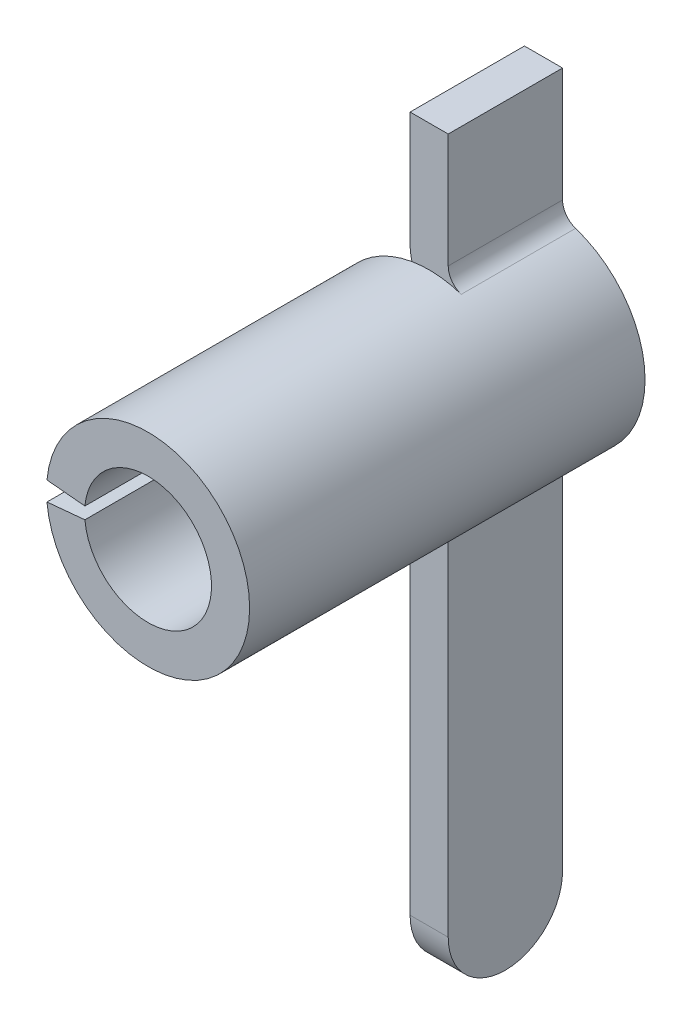
ISO-10303-21;
HEADER;
FILE_DESCRIPTION(('STEP AP214'),'2;1');
FILE_NAME('part.step','',(''),(''),'','','');
FILE_SCHEMA(('AUTOMOTIVE_DESIGN { 1 0 10303 214 1 1 1 1 }'));
ENDSEC;
DATA;
#1=APPLICATION_CONTEXT('core data for automotive mechanical design processes');
#2=APPLICATION_PROTOCOL_DEFINITION('international standard','automotive_design',2000,#1);
#3=PRODUCT_CONTEXT('',#1,'mechanical');
#4=PRODUCT('Part','Part','',(#3));
#5=PRODUCT_RELATED_PRODUCT_CATEGORY('part','',(#4));
#6=PRODUCT_DEFINITION_FORMATION('','',#4);
#7=PRODUCT_DEFINITION_CONTEXT('part definition',#1,'design');
#8=PRODUCT_DEFINITION('design','',#6,#7);
#9=PRODUCT_DEFINITION_SHAPE('','',#8);
#10=(LENGTH_UNIT() NAMED_UNIT(*) SI_UNIT(.MILLI.,.METRE.));
#11=(NAMED_UNIT(*) PLANE_ANGLE_UNIT() SI_UNIT($,.RADIAN.));
#12=(NAMED_UNIT(*) SI_UNIT($,.STERADIAN.) SOLID_ANGLE_UNIT());
#13=UNCERTAINTY_MEASURE_WITH_UNIT(LENGTH_MEASURE(1.E-05),#10,'distance_accuracy_value','');
#14=(GEOMETRIC_REPRESENTATION_CONTEXT(3) GLOBAL_UNCERTAINTY_ASSIGNED_CONTEXT((#13)) GLOBAL_UNIT_ASSIGNED_CONTEXT((#10,
#11,#12)) REPRESENTATION_CONTEXT('',''));
#15=CARTESIAN_POINT('',(0.,0.,0.));
#16=DIRECTION('',(0.,0.,1.));
#17=DIRECTION('',(1.,0.,0.));
#18=AXIS2_PLACEMENT_3D('',#15,#16,#17);
#19=CARTESIAN_POINT('',(0.306963486373836,-1.54645639494626,-11.3));
#20=DIRECTION('',(0.,0.,1.));
#21=DIRECTION('',(1.,0.,0.));
#22=AXIS2_PLACEMENT_3D('',#19,#20,#21);
#23=PLANE('',#22);
#24=DIRECTION('',(0.,1.,0.));
#25=VECTOR('',#24,1.);
#26=CARTESIAN_POINT('',(0.700000000000003,0.,-11.3));
#27=LINE('',#26,#25);
#28=CARTESIAN_POINT('',(0.700000000000005,1.79895878505357,-11.3));
#29=VERTEX_POINT('',#28);
#30=CARTESIAN_POINT('',(0.700000000000002,-1.9,-11.3));
#31=VERTEX_POINT('',#30);
#32=EDGE_CURVE('E156',#29,#31,#27,.F.);
#33=ORIENTED_EDGE('',*,*,#32,.F.);
#34=CARTESIAN_POINT('',(0.900000000000003,1.79895878505357,-11.3));
#35=DIRECTION('',(0.,0.,1.));
#36=DIRECTION('',(1.,0.,0.));
#37=AXIS2_PLACEMENT_3D('',#34,#35,#36);
#38=CIRCLE('',#37,0.2);
#39=CARTESIAN_POINT('',(0.836803799557334,1.98871188845272,-11.3));
#40=VERTEX_POINT('',#39);
#41=EDGE_CURVE('E141',#29,#40,#38,.F.);
#42=ORIENTED_EDGE('',*,*,#41,.T.);
#43=CARTESIAN_POINT('',(0.500000000000003,3.,-11.3));
#44=DIRECTION('',(0.,0.,1.));
#45=DIRECTION('',(1.,0.,0.));
#46=AXIS2_PLACEMENT_3D('',#43,#44,#45);
#47=CIRCLE('',#46,1.06589889011722);
#48=CARTESIAN_POINT('',(0.319204456495264,1.94954609077697,-11.3));
#49=VERTEX_POINT('',#48);
#50=EDGE_CURVE('E19',#40,#49,#47,.F.);
#51=ORIENTED_EDGE('',*,*,#50,.T.);
#52=CARTESIAN_POINT('',(0.900000000000003,1.79895878505357,-11.3));
#53=DIRECTION('',(0.,0.,1.));
#54=DIRECTION('',(1.,0.,0.));
#55=AXIS2_PLACEMENT_3D('',#52,#53,#54);
#56=CIRCLE('',#55,0.6);
#57=CARTESIAN_POINT('',(0.300000000000003,1.79895878505357,-11.3));
#58=VERTEX_POINT('',#57);
#59=EDGE_CURVE('E132',#49,#58,#56,.T.);
#60=ORIENTED_EDGE('',*,*,#59,.T.);
#61=DIRECTION('',(0.,-1.,0.));
#62=VECTOR('',#61,1.);
#63=CARTESIAN_POINT('',(0.300000000000003,1.79895878505357,-11.3));
#64=LINE('',#63,#62);
#65=CARTESIAN_POINT('',(0.300000000000003,-1.9,-11.3));
#66=VERTEX_POINT('',#65);
#67=EDGE_CURVE('E167',#66,#58,#64,.F.);
#68=ORIENTED_EDGE('',*,*,#67,.F.);
#69=DIRECTION('',(-1.,0.,0.));
#70=VECTOR('',#69,1.);
#71=CARTESIAN_POINT('',(-4.5,-1.9,-11.3));
#72=LINE('',#71,#70);
#73=EDGE_CURVE('E161',#31,#66,#72,.T.);
#74=ORIENTED_EDGE('',*,*,#73,.F.);
#75=EDGE_LOOP('',(#33,#42,#51,#60,#68,#74));
#76=FACE_BOUND('',#75,.T.);
#77=ADVANCED_FACE('F16',(#76),#23,.T.);
#78=CARTESIAN_POINT('',(-4.5,-1.9,-11.9));
#79=DIRECTION('',(-1.,0.,0.));
#80=DIRECTION('',(0.,0.,1.));
#81=AXIS2_PLACEMENT_3D('',#78,#79,#80);
#82=CYLINDRICAL_SURFACE('',#81,0.6);
#83=ORIENTED_EDGE('',*,*,#73,.T.);
#84=CARTESIAN_POINT('',(0.300000000000003,-1.9,-11.9));
#85=DIRECTION('',(-1.,0.,0.));
#86=DIRECTION('',(0.,0.,1.));
#87=AXIS2_PLACEMENT_3D('',#84,#85,#86);
#88=CIRCLE('',#87,0.6);
#89=CARTESIAN_POINT('',(0.300000000000003,-1.9,-12.5));
#90=VERTEX_POINT('',#89);
#91=EDGE_CURVE('E168',#90,#66,#88,.T.);
#92=ORIENTED_EDGE('',*,*,#91,.F.);
#93=DIRECTION('',(-1.,0.,0.));
#94=VECTOR('',#93,1.);
#95=CARTESIAN_POINT('',(-4.5,-1.9,-12.5));
#96=LINE('',#95,#94);
#97=CARTESIAN_POINT('',(0.700000000000003,-1.9,-12.5));
#98=VERTEX_POINT('',#97);
#99=EDGE_CURVE('E159',#90,#98,#96,.F.);
#100=ORIENTED_EDGE('',*,*,#99,.T.);
#101=CARTESIAN_POINT('',(0.700000000000003,-1.9,-11.9));
#102=DIRECTION('',(-1.,0.,0.));
#103=DIRECTION('',(0.,0.,1.));
#104=AXIS2_PLACEMENT_3D('',#101,#102,#103);
#105=CIRCLE('',#104,0.6);
#106=EDGE_CURVE('E164',#31,#98,#105,.F.);
#107=ORIENTED_EDGE('',*,*,#106,.F.);
#108=EDGE_LOOP('',(#83,#92,#100,#107));
#109=FACE_BOUND('',#108,.T.);
#110=ADVANCED_FACE('F314',(#109),#82,.T.);
#111=CARTESIAN_POINT('',(0.700000000000003,0.,-11.3));
#112=DIRECTION('',(1.,0.,0.));
#113=DIRECTION('',(0.,1.,0.));
#114=AXIS2_PLACEMENT_3D('',#111,#112,#113);
#115=PLANE('',#114);
#116=ORIENTED_EDGE('',*,*,#32,.T.);
#117=ORIENTED_EDGE('',*,*,#106,.T.);
#118=DIRECTION('',(0.,1.,0.));
#119=VECTOR('',#118,1.);
#120=CARTESIAN_POINT('',(0.700000000000003,-1.54645639494626,-12.5));
#121=LINE('',#120,#119);
#122=CARTESIAN_POINT('',(0.700000000000004,1.79895878505357,-12.5));
#123=VERTEX_POINT('',#122);
#124=EDGE_CURVE('E171',#98,#123,#121,.T.);
#125=ORIENTED_EDGE('',*,*,#124,.T.);
#126=DIRECTION('',(0.,0.,1.));
#127=VECTOR('',#126,1.);
#128=CARTESIAN_POINT('',(0.700000000000005,1.79895878505357,-11.3));
#129=LINE('',#128,#127);
#130=EDGE_CURVE('E223',#123,#29,#129,.T.);
#131=ORIENTED_EDGE('',*,*,#130,.T.);
#132=EDGE_LOOP('',(#116,#117,#125,#131));
#133=FACE_BOUND('',#132,.T.);
#134=ADVANCED_FACE('F316',(#133),#115,.T.);
#135=CARTESIAN_POINT('',(0.300000000000003,1.79895878505357,-11.3));
#136=DIRECTION('',(-1.,0.,0.));
#137=DIRECTION('',(0.,-1.,0.));
#138=AXIS2_PLACEMENT_3D('',#135,#136,#137);
#139=PLANE('',#138);
#140=DIRECTION('',(0.,1.,0.));
#141=VECTOR('',#140,1.);
#142=CARTESIAN_POINT('',(0.300000000000003,-1.54645639494626,-12.5));
#143=LINE('',#142,#141);
#144=CARTESIAN_POINT('',(0.300000000000003,1.79895878505357,-12.5));
#145=VERTEX_POINT('',#144);
#146=EDGE_CURVE('E181',#145,#90,#143,.F.);
#147=ORIENTED_EDGE('',*,*,#146,.T.);
#148=ORIENTED_EDGE('',*,*,#91,.T.);
#149=ORIENTED_EDGE('',*,*,#67,.T.);
#150=DIRECTION('',(0.,0.,1.));
#151=VECTOR('',#150,1.);
#152=CARTESIAN_POINT('',(0.300000000000003,1.79895878505357,-11.3));
#153=LINE('',#152,#151);
#154=EDGE_CURVE('E138',#58,#145,#153,.F.);
#155=ORIENTED_EDGE('',*,*,#154,.T.);
#156=EDGE_LOOP('',(#147,#148,#149,#155));
#157=FACE_BOUND('',#156,.T.);
#158=ADVANCED_FACE('F311',(#157),#139,.T.);
#159=CARTESIAN_POINT('',(0.306963486373836,-1.54645639494626,-12.5));
#160=DIRECTION('',(0.,0.,1.));
#161=DIRECTION('',(1.,0.,0.));
#162=AXIS2_PLACEMENT_3D('',#159,#160,#161);
#163=PLANE('',#162);
#164=CARTESIAN_POINT('',(0.900000000000003,1.79895878505357,-12.5));
#165=DIRECTION('',(0.,0.,1.));
#166=DIRECTION('',(1.,0.,0.));
#167=AXIS2_PLACEMENT_3D('',#164,#165,#166);
#168=CIRCLE('',#167,0.6);
#169=CARTESIAN_POINT('',(0.710411398671996,2.36821809525103,-12.5));
#170=VERTEX_POINT('',#169);
#171=EDGE_CURVE('E179',#170,#145,#168,.T.);
#172=ORIENTED_EDGE('',*,*,#171,.F.);
#173=CARTESIAN_POINT('',(0.500000000000003,3.,-12.5));
#174=DIRECTION('',(0.,0.,1.));
#175=DIRECTION('',(1.,0.,0.));
#176=AXIS2_PLACEMENT_3D('',#173,#174,#175);
#177=CIRCLE('',#176,0.665898890117217);
#178=CARTESIAN_POINT('',(0.710411398671996,3.63178190474897,-12.5));
#179=VERTEX_POINT('',#178);
#180=EDGE_CURVE('E177',#179,#170,#177,.F.);
#181=ORIENTED_EDGE('',*,*,#180,.F.);
#182=CARTESIAN_POINT('',(0.900000000000003,4.20104121494643,-12.5));
#183=DIRECTION('',(0.,0.,1.));
#184=DIRECTION('',(1.,0.,0.));
#185=AXIS2_PLACEMENT_3D('',#182,#183,#184);
#186=CIRCLE('',#185,0.6);
#187=CARTESIAN_POINT('',(0.300000000000003,4.20104121494643,-12.5));
#188=VERTEX_POINT('',#187);
#189=EDGE_CURVE('E182',#188,#179,#186,.T.);
#190=ORIENTED_EDGE('',*,*,#189,.F.);
#191=DIRECTION('',(0.,-1.,0.));
#192=VECTOR('',#191,1.);
#193=CARTESIAN_POINT('',(0.300000000000004,5.4,-12.5));
#194=LINE('',#193,#192);
#195=CARTESIAN_POINT('',(0.300000000000004,5.4,-12.5));
#196=VERTEX_POINT('',#195);
#197=EDGE_CURVE('E237',#196,#188,#194,.T.);
#198=ORIENTED_EDGE('',*,*,#197,.F.);
#199=DIRECTION('',(1.,0.,0.));
#200=VECTOR('',#199,1.);
#201=CARTESIAN_POINT('',(0.700000000000004,5.4,-12.5));
#202=LINE('',#201,#200);
#203=CARTESIAN_POINT('',(0.700000000000004,5.4,-12.5));
#204=VERTEX_POINT('',#203);
#205=EDGE_CURVE('E230',#204,#196,#202,.F.);
#206=ORIENTED_EDGE('',*,*,#205,.F.);
#207=DIRECTION('',(0.,1.,0.));
#208=VECTOR('',#207,1.);
#209=CARTESIAN_POINT('',(0.700000000000004,4.20104121494643,-12.5));
#210=LINE('',#209,#208);
#211=CARTESIAN_POINT('',(0.700000000000004,4.20104121494643,-12.5));
#212=VERTEX_POINT('',#211);
#213=EDGE_CURVE('E239',#212,#204,#210,.T.);
#214=ORIENTED_EDGE('',*,*,#213,.F.);
#215=CARTESIAN_POINT('',(0.900000000000003,4.20104121494643,-12.5));
#216=DIRECTION('',(0.,0.,1.));
#217=DIRECTION('',(1.,0.,0.));
#218=AXIS2_PLACEMENT_3D('',#215,#216,#217);
#219=CIRCLE('',#218,0.2);
#220=CARTESIAN_POINT('',(0.836803799557334,4.01128811154728,-12.5));
#221=VERTEX_POINT('',#220);
#222=EDGE_CURVE('E185',#212,#221,#219,.T.);
#223=ORIENTED_EDGE('',*,*,#222,.T.);
#224=CARTESIAN_POINT('',(0.500000000000003,3.,-12.5));
#225=DIRECTION('',(0.,0.,1.));
#226=DIRECTION('',(1.,0.,0.));
#227=AXIS2_PLACEMENT_3D('',#224,#225,#226);
#228=CIRCLE('',#227,1.06589889011722);
#229=CARTESIAN_POINT('',(0.836803799557334,1.98871188845272,-12.5));
#230=VERTEX_POINT('',#229);
#231=EDGE_CURVE('E175',#230,#221,#228,.T.);
#232=ORIENTED_EDGE('',*,*,#231,.F.);
#233=CARTESIAN_POINT('',(0.900000000000003,1.79895878505357,-12.5));
#234=DIRECTION('',(0.,0.,1.));
#235=DIRECTION('',(1.,0.,0.));
#236=AXIS2_PLACEMENT_3D('',#233,#234,#235);
#237=CIRCLE('',#236,0.2);
#238=EDGE_CURVE('E172',#123,#230,#237,.F.);
#239=ORIENTED_EDGE('',*,*,#238,.F.);
#240=ORIENTED_EDGE('',*,*,#124,.F.);
#241=ORIENTED_EDGE('',*,*,#99,.F.);
#242=ORIENTED_EDGE('',*,*,#146,.F.);
#243=EDGE_LOOP('',(#172,#181,#190,#198,#206,#214,#223,#232,#239,#240,#241,#242));
#244=FACE_BOUND('',#243,.T.);
#245=ADVANCED_FACE('F306',(#244),#163,.F.);
#246=CARTESIAN_POINT('',(0.300000000000004,5.4,-11.3));
#247=DIRECTION('',(-1.,0.,0.));
#248=DIRECTION('',(0.,-1.,0.));
#249=AXIS2_PLACEMENT_3D('',#246,#247,#248);
#250=PLANE('',#249);
#251=ORIENTED_EDGE('',*,*,#197,.T.);
#252=DIRECTION('',(0.,0.,1.));
#253=VECTOR('',#252,1.);
#254=CARTESIAN_POINT('',(0.300000000000004,4.20104121494643,-11.3));
#255=LINE('',#254,#253);
#256=CARTESIAN_POINT('',(0.300000000000004,4.20104121494643,-11.3));
#257=VERTEX_POINT('',#256);
#258=EDGE_CURVE('E186',#257,#188,#255,.F.);
#259=ORIENTED_EDGE('',*,*,#258,.F.);
#260=DIRECTION('',(0.,1.,0.));
#261=VECTOR('',#260,1.);
#262=CARTESIAN_POINT('',(0.300000000000004,-1.54645639494626,-11.3));
#263=LINE('',#262,#261);
#264=CARTESIAN_POINT('',(0.300000000000004,5.4,-11.3));
#265=VERTEX_POINT('',#264);
#266=EDGE_CURVE('E194',#265,#257,#263,.F.);
#267=ORIENTED_EDGE('',*,*,#266,.F.);
#268=DIRECTION('',(0.,0.,1.));
#269=VECTOR('',#268,1.);
#270=CARTESIAN_POINT('',(0.300000000000004,5.4,-11.3));
#271=LINE('',#270,#269);
#272=EDGE_CURVE('E233',#196,#265,#271,.T.);
#273=ORIENTED_EDGE('',*,*,#272,.F.);
#274=EDGE_LOOP('',(#251,#259,#267,#273));
#275=FACE_BOUND('',#274,.T.);
#276=ADVANCED_FACE('F338',(#275),#250,.T.);
#277=CARTESIAN_POINT('',(0.700000000000004,4.20104121494643,-11.3));
#278=DIRECTION('',(1.,0.,0.));
#279=DIRECTION('',(0.,0.,-1.));
#280=AXIS2_PLACEMENT_3D('',#277,#278,#279);
#281=PLANE('',#280);
#282=ORIENTED_EDGE('',*,*,#213,.T.);
#283=DIRECTION('',(0.,0.,1.));
#284=VECTOR('',#283,1.);
#285=CARTESIAN_POINT('',(0.700000000000004,5.4,-11.3));
#286=LINE('',#285,#284);
#287=CARTESIAN_POINT('',(0.700000000000004,5.4,-11.3));
#288=VERTEX_POINT('',#287);
#289=EDGE_CURVE('E234',#288,#204,#286,.F.);
#290=ORIENTED_EDGE('',*,*,#289,.F.);
#291=DIRECTION('',(0.,1.,0.));
#292=VECTOR('',#291,1.);
#293=CARTESIAN_POINT('',(0.700000000000004,-1.54645639494626,-11.3));
#294=LINE('',#293,#292);
#295=CARTESIAN_POINT('',(0.700000000000004,4.20104121494643,-11.3));
#296=VERTEX_POINT('',#295);
#297=EDGE_CURVE('E197',#296,#288,#294,.T.);
#298=ORIENTED_EDGE('',*,*,#297,.F.);
#299=DIRECTION('',(0.,0.,1.));
#300=VECTOR('',#299,1.);
#301=CARTESIAN_POINT('',(0.700000000000003,4.20104121494643,-11.3));
#302=LINE('',#301,#300);
#303=EDGE_CURVE('E189',#296,#212,#302,.F.);
#304=ORIENTED_EDGE('',*,*,#303,.T.);
#305=EDGE_LOOP('',(#282,#290,#298,#304));
#306=FACE_BOUND('',#305,.T.);
#307=ADVANCED_FACE('F344',(#306),#281,.T.);
#308=CARTESIAN_POINT('',(0.700000000000004,5.4,-11.3));
#309=DIRECTION('',(0.,1.,0.));
#310=DIRECTION('',(0.,0.,1.));
#311=AXIS2_PLACEMENT_3D('',#308,#309,#310);
#312=PLANE('',#311);
#313=ORIENTED_EDGE('',*,*,#205,.T.);
#314=ORIENTED_EDGE('',*,*,#272,.T.);
#315=DIRECTION('',(1.,0.,0.));
#316=VECTOR('',#315,1.);
#317=CARTESIAN_POINT('',(0.306963486373836,5.4,-11.3));
#318=LINE('',#317,#316);
#319=EDGE_CURVE('E201',#288,#265,#318,.F.);
#320=ORIENTED_EDGE('',*,*,#319,.F.);
#321=ORIENTED_EDGE('',*,*,#289,.T.);
#322=EDGE_LOOP('',(#313,#314,#320,#321));
#323=FACE_BOUND('',#322,.T.);
#324=ADVANCED_FACE('F341',(#323),#312,.T.);
#325=CARTESIAN_POINT('',(0.900000000000003,4.20104121494643,-11.3));
#326=DIRECTION('',(0.,0.,1.));
#327=DIRECTION('',(1.,0.,0.));
#328=AXIS2_PLACEMENT_3D('',#325,#326,#327);
#329=CYLINDRICAL_SURFACE('',#328,0.6);
#330=DIRECTION('',(0.,0.,1.));
#331=VECTOR('',#330,1.);
#332=CARTESIAN_POINT('',(0.710411398671996,3.63178190474897,-11.3));
#333=LINE('',#332,#331);
#334=CARTESIAN_POINT('',(0.710411398671996,3.63178190474897,-11.3));
#335=VERTEX_POINT('',#334);
#336=EDGE_CURVE('E205',#179,#335,#333,.T.);
#337=ORIENTED_EDGE('',*,*,#336,.T.);
#338=CARTESIAN_POINT('',(0.900000000000003,4.20104121494643,-11.3));
#339=DIRECTION('',(0.,0.,1.));
#340=DIRECTION('',(1.,0.,0.));
#341=AXIS2_PLACEMENT_3D('',#338,#339,#340);
#342=CIRCLE('',#341,0.6);
#343=CARTESIAN_POINT('',(0.319204456495264,4.05045390922303,-11.3));
#344=VERTEX_POINT('',#343);
#345=EDGE_CURVE('E198',#335,#344,#342,.F.);
#346=ORIENTED_EDGE('',*,*,#345,.T.);
#347=CARTESIAN_POINT('',(0.900000000000003,4.20104121494643,-11.3));
#348=DIRECTION('',(0.,0.,1.));
#349=DIRECTION('',(1.,0.,0.));
#350=AXIS2_PLACEMENT_3D('',#347,#348,#349);
#351=CIRCLE('',#350,0.6);
#352=EDGE_CURVE('E190',#257,#344,#351,.T.);
#353=ORIENTED_EDGE('',*,*,#352,.F.);
#354=ORIENTED_EDGE('',*,*,#258,.T.);
#355=ORIENTED_EDGE('',*,*,#189,.T.);
#356=EDGE_LOOP('',(#337,#346,#353,#354,#355));
#357=FACE_BOUND('',#356,.T.);
#358=ADVANCED_FACE('F334',(#357),#329,.T.);
#359=CARTESIAN_POINT('',(0.900000000000003,4.20104121494643,-11.3));
#360=DIRECTION('',(0.,0.,1.));
#361=DIRECTION('',(1.,0.,0.));
#362=AXIS2_PLACEMENT_3D('',#359,#360,#361);
#363=CYLINDRICAL_SURFACE('',#362,0.2);
#364=CARTESIAN_POINT('',(0.900000000000003,4.20104121494643,-11.3));
#365=DIRECTION('',(0.,0.,1.));
#366=DIRECTION('',(1.,0.,0.));
#367=AXIS2_PLACEMENT_3D('',#364,#365,#366);
#368=CIRCLE('',#367,0.2);
#369=CARTESIAN_POINT('',(0.836803799557334,4.01128811154728,-11.3));
#370=VERTEX_POINT('',#369);
#371=EDGE_CURVE('E193',#370,#296,#368,.F.);
#372=ORIENTED_EDGE('',*,*,#371,.F.);
#373=DIRECTION('',(0.,0.,1.));
#374=VECTOR('',#373,1.);
#375=CARTESIAN_POINT('',(0.836803799557334,4.01128811154728,-11.3));
#376=LINE('',#375,#374);
#377=EDGE_CURVE('E212',#221,#370,#376,.T.);
#378=ORIENTED_EDGE('',*,*,#377,.F.);
#379=ORIENTED_EDGE('',*,*,#222,.F.);
#380=ORIENTED_EDGE('',*,*,#303,.F.);
#381=EDGE_LOOP('',(#372,#378,#379,#380));
#382=FACE_BOUND('',#381,.T.);
#383=ADVANCED_FACE('F323',(#382),#363,.F.);
#384=CARTESIAN_POINT('',(0.306963486373836,-1.54645639494626,-11.3));
#385=DIRECTION('',(0.,0.,1.));
#386=DIRECTION('',(1.,0.,0.));
#387=AXIS2_PLACEMENT_3D('',#384,#385,#386);
#388=PLANE('',#387);
#389=ORIENTED_EDGE('',*,*,#297,.T.);
#390=ORIENTED_EDGE('',*,*,#319,.T.);
#391=ORIENTED_EDGE('',*,*,#266,.T.);
#392=ORIENTED_EDGE('',*,*,#352,.T.);
#393=CARTESIAN_POINT('',(0.500000000000003,3.,-11.3));
#394=DIRECTION('',(0.,0.,1.));
#395=DIRECTION('',(1.,0.,0.));
#396=AXIS2_PLACEMENT_3D('',#393,#394,#395);
#397=CIRCLE('',#396,1.06589889011722);
#398=EDGE_CURVE('E208',#370,#344,#397,.T.);
#399=ORIENTED_EDGE('',*,*,#398,.F.);
#400=ORIENTED_EDGE('',*,*,#371,.T.);
#401=EDGE_LOOP('',(#389,#390,#391,#392,#399,#400));
#402=FACE_BOUND('',#401,.T.);
#403=ADVANCED_FACE('F327',(#402),#388,.T.);
#404=CARTESIAN_POINT('',(0.500000000000003,3.,-11.3));
#405=DIRECTION('',(0.,0.,1.));
#406=DIRECTION('',(1.,0.,0.));
#407=AXIS2_PLACEMENT_3D('',#404,#405,#406);
#408=PLANE('',#407);
#409=DIRECTION('',(-0.995589408972611,0.0938175289675008,0.));
#410=VECTOR('',#409,1.);
#411=CARTESIAN_POINT('',(-0.162961882447315,3.062472988413,-11.3));
#412=LINE('',#411,#410);
#413=CARTESIAN_POINT('',(-0.162961882447315,3.062472988413,-11.3));
#414=VERTEX_POINT('',#413);
#415=CARTESIAN_POINT('',(-0.561197646036359,3.1,-11.3));
#416=VERTEX_POINT('',#415);
#417=EDGE_CURVE('E265',#414,#416,#412,.T.);
#418=ORIENTED_EDGE('',*,*,#417,.T.);
#419=CARTESIAN_POINT('',(0.500000000000003,3.,-11.3));
#420=DIRECTION('',(0.,0.,1.));
#421=DIRECTION('',(1.,0.,0.));
#422=AXIS2_PLACEMENT_3D('',#419,#420,#421);
#423=CIRCLE('',#422,1.06589889011722);
#424=EDGE_CURVE('E211',#344,#416,#423,.T.);
#425=ORIENTED_EDGE('',*,*,#424,.F.);
#426=ORIENTED_EDGE('',*,*,#345,.F.);
#427=CARTESIAN_POINT('',(0.500000000000003,3.,-11.3));
#428=DIRECTION('',(0.,0.,1.));
#429=DIRECTION('',(1.,0.,0.));
#430=AXIS2_PLACEMENT_3D('',#427,#428,#429);
#431=CIRCLE('',#430,0.665898890117217);
#432=EDGE_CURVE('E202',#335,#414,#431,.T.);
#433=ORIENTED_EDGE('',*,*,#432,.T.);
#434=EDGE_LOOP('',(#418,#425,#426,#433));
#435=FACE_BOUND('',#434,.T.);
#436=ADVANCED_FACE('F333',(#435),#408,.F.);
#437=CARTESIAN_POINT('',(-0.162961882447315,3.062472988413,-5.33850511374683));
#438=DIRECTION('',(0.0938175289675008,0.995589408972611,0.));
#439=DIRECTION('',(-0.995589408972611,0.0938175289675008,0.));
#440=AXIS2_PLACEMENT_3D('',#437,#438,#439);
#441=PLANE('',#440);
#442=ORIENTED_EDGE('',*,*,#417,.F.);
#443=DIRECTION('',(0.,0.,1.));
#444=VECTOR('',#443,1.);
#445=CARTESIAN_POINT('',(-0.162961882447315,3.062472988413,-11.3));
#446=LINE('',#445,#444);
#447=CARTESIAN_POINT('',(-0.162961882447315,3.062472988413,-8.35));
#448=VERTEX_POINT('',#447);
#449=EDGE_CURVE('E204',#414,#448,#446,.T.);
#450=ORIENTED_EDGE('',*,*,#449,.T.);
#451=DIRECTION('',(-0.995589408972611,0.0938175289675008,0.));
#452=VECTOR('',#451,1.);
#453=CARTESIAN_POINT('',(-0.162961882447315,3.062472988413,-8.35));
#454=LINE('',#453,#452);
#455=CARTESIAN_POINT('',(-0.561197646036359,3.1,-8.35));
#456=VERTEX_POINT('',#455);
#457=EDGE_CURVE('E200',#456,#448,#454,.F.);
#458=ORIENTED_EDGE('',*,*,#457,.F.);
#459=DIRECTION('',(0.,0.,1.));
#460=VECTOR('',#459,1.);
#461=CARTESIAN_POINT('',(-0.561197646036359,3.1,-11.3));
#462=LINE('',#461,#460);
#463=EDGE_CURVE('E215',#416,#456,#462,.T.);
#464=ORIENTED_EDGE('',*,*,#463,.F.);
#465=EDGE_LOOP('',(#442,#450,#458,#464));
#466=FACE_BOUND('',#465,.T.);
#467=ADVANCED_FACE('F297',(#466),#441,.F.);
#468=CARTESIAN_POINT('',(0.500000000000003,3.,-11.3));
#469=DIRECTION('',(0.,0.,1.));
#470=DIRECTION('',(1.,0.,0.));
#471=AXIS2_PLACEMENT_3D('',#468,#469,#470);
#472=CYLINDRICAL_SURFACE('',#471,0.665898890117217);
#473=ORIENTED_EDGE('',*,*,#180,.T.);
#474=DIRECTION('',(0.,0.,1.));
#475=VECTOR('',#474,1.);
#476=CARTESIAN_POINT('',(0.710411398671996,2.36821809525103,-11.3));
#477=LINE('',#476,#475);
#478=CARTESIAN_POINT('',(0.710411398671996,2.36821809525103,-11.3));
#479=VERTEX_POINT('',#478);
#480=EDGE_CURVE('E207',#479,#170,#477,.F.);
#481=ORIENTED_EDGE('',*,*,#480,.F.);
#482=CARTESIAN_POINT('',(0.500000000000003,3.,-11.3));
#483=DIRECTION('',(0.,0.,1.));
#484=DIRECTION('',(1.,0.,0.));
#485=AXIS2_PLACEMENT_3D('',#482,#483,#484);
#486=CIRCLE('',#485,0.665898890117217);
#487=CARTESIAN_POINT('',(-0.162961882447315,2.937527011587,-11.3));
#488=VERTEX_POINT('',#487);
#489=EDGE_CURVE('E149',#488,#479,#486,.T.);
#490=ORIENTED_EDGE('',*,*,#489,.F.);
#491=DIRECTION('',(0.,0.,1.));
#492=VECTOR('',#491,1.);
#493=CARTESIAN_POINT('',(-0.162961882447315,2.937527011587,-5.33850511374683));
#494=LINE('',#493,#492);
#495=CARTESIAN_POINT('',(-0.162961882447315,2.937527011587,-8.35));
#496=VERTEX_POINT('',#495);
#497=EDGE_CURVE('E151',#488,#496,#494,.T.);
#498=ORIENTED_EDGE('',*,*,#497,.T.);
#499=CARTESIAN_POINT('',(0.500000000000003,3.,-8.35));
#500=DIRECTION('',(0.,0.,1.));
#501=DIRECTION('',(1.,0.,0.));
#502=AXIS2_PLACEMENT_3D('',#499,#500,#501);
#503=CIRCLE('',#502,0.665898890117217);
#504=EDGE_CURVE('E216',#448,#496,#503,.F.);
#505=ORIENTED_EDGE('',*,*,#504,.F.);
#506=ORIENTED_EDGE('',*,*,#449,.F.);
#507=ORIENTED_EDGE('',*,*,#432,.F.);
#508=ORIENTED_EDGE('',*,*,#336,.F.);
#509=EDGE_LOOP('',(#473,#481,#490,#498,#505,#506,#507,#508));
#510=FACE_BOUND('',#509,.T.);
#511=ADVANCED_FACE('F301',(#510),#472,.F.);
#512=CARTESIAN_POINT('',(0.900000000000003,1.79895878505357,-11.3));
#513=DIRECTION('',(0.,0.,1.));
#514=DIRECTION('',(1.,0.,0.));
#515=AXIS2_PLACEMENT_3D('',#512,#513,#514);
#516=CYLINDRICAL_SURFACE('',#515,0.6);
#517=ORIENTED_EDGE('',*,*,#154,.F.);
#518=ORIENTED_EDGE('',*,*,#59,.F.);
#519=CARTESIAN_POINT('',(0.900000000000003,1.79895878505357,-11.3));
#520=DIRECTION('',(0.,0.,1.));
#521=DIRECTION('',(1.,0.,0.));
#522=AXIS2_PLACEMENT_3D('',#519,#520,#521);
#523=CIRCLE('',#522,0.6);
#524=EDGE_CURVE('E136',#49,#479,#523,.F.);
#525=ORIENTED_EDGE('',*,*,#524,.T.);
#526=ORIENTED_EDGE('',*,*,#480,.T.);
#527=ORIENTED_EDGE('',*,*,#171,.T.);
#528=EDGE_LOOP('',(#517,#518,#525,#526,#527));
#529=FACE_BOUND('',#528,.T.);
#530=ADVANCED_FACE('F133',(#529),#516,.T.);
#531=CARTESIAN_POINT('',(-2.7,-1.,-8.35));
#532=DIRECTION('',(0.,0.,1.));
#533=DIRECTION('',(1.,0.,0.));
#534=AXIS2_PLACEMENT_3D('',#531,#532,#533);
#535=PLANE('',#534);
#536=ORIENTED_EDGE('',*,*,#457,.T.);
#537=ORIENTED_EDGE('',*,*,#504,.T.);
#538=DIRECTION('',(0.995589408972611,0.093817528967502,0.));
#539=VECTOR('',#538,1.);
#540=CARTESIAN_POINT('',(-0.162961882447314,2.937527011587,-8.35));
#541=LINE('',#540,#539);
#542=CARTESIAN_POINT('',(-0.561197646036359,2.9,-8.35));
#543=VERTEX_POINT('',#542);
#544=EDGE_CURVE('E217',#496,#543,#541,.F.);
#545=ORIENTED_EDGE('',*,*,#544,.T.);
#546=CARTESIAN_POINT('',(0.500000000000003,3.,-8.35));
#547=DIRECTION('',(0.,0.,1.));
#548=DIRECTION('',(1.,0.,0.));
#549=AXIS2_PLACEMENT_3D('',#546,#547,#548);
#550=CIRCLE('',#549,1.06589889011722);
#551=EDGE_CURVE('E219',#456,#543,#550,.F.);
#552=ORIENTED_EDGE('',*,*,#551,.F.);
#553=EDGE_LOOP('',(#536,#537,#545,#552));
#554=FACE_BOUND('',#553,.T.);
#555=ADVANCED_FACE('F290',(#554),#535,.T.);
#556=CARTESIAN_POINT('',(-0.162961882447314,2.937527011587,-5.33850511374683));
#557=DIRECTION('',(0.093817528967502,-0.995589408972611,0.));
#558=DIRECTION('',(0.995589408972611,0.093817528967502,0.));
#559=AXIS2_PLACEMENT_3D('',#556,#557,#558);
#560=PLANE('',#559);
#561=DIRECTION('',(-0.995589408972611,-0.093817528967502,0.));
#562=VECTOR('',#561,1.);
#563=CARTESIAN_POINT('',(-0.162961882447315,2.937527011587,-11.3));
#564=LINE('',#563,#562);
#565=CARTESIAN_POINT('',(-0.561197646036359,2.9,-11.3));
#566=VERTEX_POINT('',#565);
#567=EDGE_CURVE('E34',#488,#566,#564,.T.);
#568=ORIENTED_EDGE('',*,*,#567,.T.);
#569=DIRECTION('',(0.,0.,1.));
#570=VECTOR('',#569,1.);
#571=CARTESIAN_POINT('',(-0.561197646036359,2.9,-11.3));
#572=LINE('',#571,#570);
#573=EDGE_CURVE('E145',#543,#566,#572,.F.);
#574=ORIENTED_EDGE('',*,*,#573,.F.);
#575=ORIENTED_EDGE('',*,*,#544,.F.);
#576=ORIENTED_EDGE('',*,*,#497,.F.);
#577=EDGE_LOOP('',(#568,#574,#575,#576));
#578=FACE_BOUND('',#577,.T.);
#579=ADVANCED_FACE('F292',(#578),#560,.F.);
#580=CARTESIAN_POINT('',(0.500000000000003,3.,-11.3));
#581=DIRECTION('',(0.,0.,1.));
#582=DIRECTION('',(1.,0.,0.));
#583=AXIS2_PLACEMENT_3D('',#580,#581,#582);
#584=PLANE('',#583);
#585=ORIENTED_EDGE('',*,*,#567,.F.);
#586=ORIENTED_EDGE('',*,*,#489,.T.);
#587=ORIENTED_EDGE('',*,*,#524,.F.);
#588=CARTESIAN_POINT('',(0.500000000000003,3.,-11.3));
#589=DIRECTION('',(0.,0.,1.));
#590=DIRECTION('',(1.,0.,0.));
#591=AXIS2_PLACEMENT_3D('',#588,#589,#590);
#592=CIRCLE('',#591,1.06589889011722);
#593=EDGE_CURVE('E25',#566,#49,#592,.T.);
#594=ORIENTED_EDGE('',*,*,#593,.F.);
#595=EDGE_LOOP('',(#585,#586,#587,#594));
#596=FACE_BOUND('',#595,.T.);
#597=ADVANCED_FACE('F148',(#596),#584,.F.);
#598=CARTESIAN_POINT('',(0.900000000000003,1.79895878505357,-11.3));
#599=DIRECTION('',(0.,0.,1.));
#600=DIRECTION('',(1.,0.,0.));
#601=AXIS2_PLACEMENT_3D('',#598,#599,#600);
#602=CYLINDRICAL_SURFACE('',#601,0.2);
#603=ORIENTED_EDGE('',*,*,#41,.F.);
#604=ORIENTED_EDGE('',*,*,#130,.F.);
#605=ORIENTED_EDGE('',*,*,#238,.T.);
#606=DIRECTION('',(0.,0.,1.));
#607=VECTOR('',#606,1.);
#608=CARTESIAN_POINT('',(0.836803799557333,1.98871188845272,-11.3));
#609=LINE('',#608,#607);
#610=EDGE_CURVE('E11',#40,#230,#609,.F.);
#611=ORIENTED_EDGE('',*,*,#610,.F.);
#612=EDGE_LOOP('',(#603,#604,#605,#611));
#613=FACE_BOUND('',#612,.T.);
#614=ADVANCED_FACE('F318',(#613),#602,.F.);
#615=CARTESIAN_POINT('',(0.500000000000003,3.,-11.3));
#616=DIRECTION('',(0.,0.,1.));
#617=DIRECTION('',(1.,0.,0.));
#618=AXIS2_PLACEMENT_3D('',#615,#616,#617);
#619=CYLINDRICAL_SURFACE('',#618,1.06589889011722);
#620=ORIENTED_EDGE('',*,*,#50,.F.);
#621=ORIENTED_EDGE('',*,*,#610,.T.);
#622=ORIENTED_EDGE('',*,*,#231,.T.);
#623=ORIENTED_EDGE('',*,*,#377,.T.);
#624=ORIENTED_EDGE('',*,*,#398,.T.);
#625=ORIENTED_EDGE('',*,*,#424,.T.);
#626=ORIENTED_EDGE('',*,*,#463,.T.);
#627=ORIENTED_EDGE('',*,*,#551,.T.);
#628=ORIENTED_EDGE('',*,*,#573,.T.);
#629=ORIENTED_EDGE('',*,*,#593,.T.);
#630=EDGE_LOOP('',(#620,#621,#622,#623,#624,#625,#626,#627,#628,#629));
#631=FACE_BOUND('',#630,.T.);
#632=ADVANCED_FACE('F143',(#631),#619,.T.);
#633=CLOSED_SHELL('',(#77,#110,#134,#158,#245,#276,#307,#324,#358,#383,#403,#436,#467,#511,#530,
#555,#579,#597,#614,#632));
#634=MANIFOLD_SOLID_BREP('B1',#633);
#635=ADVANCED_BREP_SHAPE_REPRESENTATION('',(#18,#634),#14);
#636=SHAPE_DEFINITION_REPRESENTATION(#9,#635);
ENDSEC;
END-ISO-10303-21;
